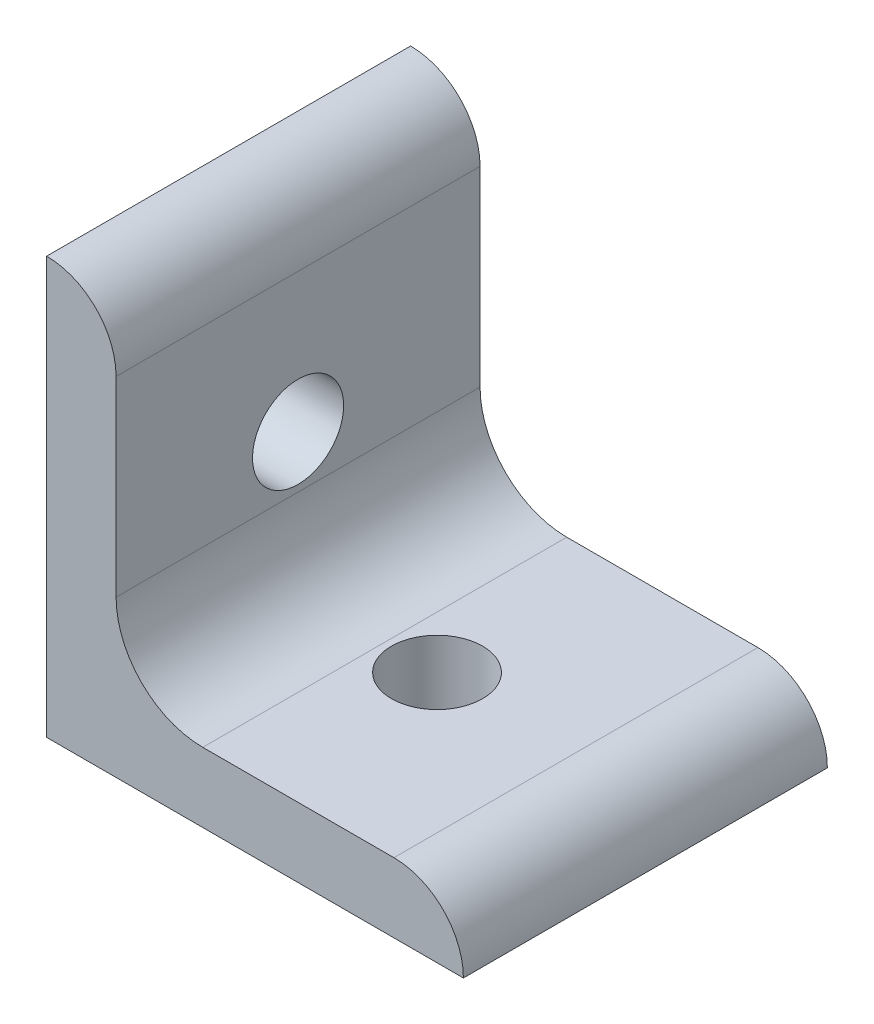
ISO-10303-21;
HEADER;
FILE_DESCRIPTION(('STEP AP214'),'2;1');
FILE_NAME('part.step','',(''),(''),'','','');
FILE_SCHEMA(('AUTOMOTIVE_DESIGN { 1 0 10303 214 1 1 1 1 }'));
ENDSEC;
DATA;
#1=APPLICATION_CONTEXT('core data for automotive mechanical design processes');
#2=APPLICATION_PROTOCOL_DEFINITION('international standard','automotive_design',2000,#1);
#3=PRODUCT_CONTEXT('',#1,'mechanical');
#4=PRODUCT('Part','Part','',(#3));
#5=PRODUCT_RELATED_PRODUCT_CATEGORY('part','',(#4));
#6=PRODUCT_DEFINITION_FORMATION('','',#4);
#7=PRODUCT_DEFINITION_CONTEXT('part definition',#1,'design');
#8=PRODUCT_DEFINITION('design','',#6,#7);
#9=PRODUCT_DEFINITION_SHAPE('','',#8);
#10=(LENGTH_UNIT() NAMED_UNIT(*) SI_UNIT(.MILLI.,.METRE.));
#11=(NAMED_UNIT(*) PLANE_ANGLE_UNIT() SI_UNIT($,.RADIAN.));
#12=(NAMED_UNIT(*) SI_UNIT($,.STERADIAN.) SOLID_ANGLE_UNIT());
#13=UNCERTAINTY_MEASURE_WITH_UNIT(LENGTH_MEASURE(1.E-05),#10,'distance_accuracy_value','');
#14=(GEOMETRIC_REPRESENTATION_CONTEXT(3) GLOBAL_UNCERTAINTY_ASSIGNED_CONTEXT((#13)) GLOBAL_UNIT_ASSIGNED_CONTEXT((#10,
#11,#12)) REPRESENTATION_CONTEXT('',''));
#15=CARTESIAN_POINT('',(0.,0.,0.));
#16=DIRECTION('',(0.,0.,1.));
#17=DIRECTION('',(1.,0.,0.));
#18=AXIS2_PLACEMENT_3D('',#15,#16,#17);
#19=CARTESIAN_POINT('',(6.35,31.75,16.637));
#20=DIRECTION('',(-1.,0.,0.));
#21=DIRECTION('',(0.,-1.,0.));
#22=AXIS2_PLACEMENT_3D('',#19,#20,#21);
#23=PLANE('',#22);
#24=DIRECTION('',(0.,1.,0.));
#25=VECTOR('',#24,1.);
#26=CARTESIAN_POINT('',(6.35,31.75,-16.637));
#27=LINE('',#26,#25);
#28=CARTESIAN_POINT('',(6.35,14.2748,-16.637));
#29=VERTEX_POINT('',#28);
#30=CARTESIAN_POINT('',(6.35,31.75,-16.637));
#31=VERTEX_POINT('',#30);
#32=EDGE_CURVE('E114',#29,#31,#27,.T.);
#33=ORIENTED_EDGE('',*,*,#32,.T.);
#34=DIRECTION('',(0.,0.,-1.));
#35=VECTOR('',#34,1.);
#36=CARTESIAN_POINT('',(6.35,31.75,16.637));
#37=LINE('',#36,#35);
#38=CARTESIAN_POINT('',(6.35,31.75,16.637));
#39=VERTEX_POINT('',#38);
#40=EDGE_CURVE('E111',#39,#31,#37,.T.);
#41=ORIENTED_EDGE('',*,*,#40,.F.);
#42=DIRECTION('',(0.,1.,0.));
#43=VECTOR('',#42,1.);
#44=CARTESIAN_POINT('',(6.35,31.75,16.637));
#45=LINE('',#44,#43);
#46=CARTESIAN_POINT('',(6.35,14.2748,16.637));
#47=VERTEX_POINT('',#46);
#48=EDGE_CURVE('E100',#47,#39,#45,.T.);
#49=ORIENTED_EDGE('',*,*,#48,.F.);
#50=DIRECTION('',(0.,0.,-1.));
#51=VECTOR('',#50,1.);
#52=CARTESIAN_POINT('',(6.35,14.2748,16.637));
#53=LINE('',#52,#51);
#54=EDGE_CURVE('E115',#47,#29,#53,.T.);
#55=ORIENTED_EDGE('',*,*,#54,.T.);
#56=EDGE_LOOP('',(#33,#41,#49,#55));
#57=FACE_BOUND('',#56,.T.);
#58=CARTESIAN_POINT('',(6.34999999999999,19.05,0.));
#59=DIRECTION('',(-1.,0.,0.));
#60=DIRECTION('',(0.,-1.,0.));
#61=AXIS2_PLACEMENT_3D('',#58,#59,#60);
#62=CIRCLE('',#61,4.1656);
#63=CARTESIAN_POINT('',(6.35,14.8844,0.));
#64=VERTEX_POINT('',#63);
#65=EDGE_CURVE('E164',#64,#64,#62,.F.);
#66=ORIENTED_EDGE('',*,*,#65,.F.);
#67=EDGE_LOOP('',(#66));
#68=FACE_BOUND('',#67,.T.);
#69=ADVANCED_FACE('F32',(#57,#68),#23,.F.);
#70=CARTESIAN_POINT('',(0.,0.,16.637));
#71=DIRECTION('',(1.,0.,0.));
#72=DIRECTION('',(0.,0.,-1.));
#73=AXIS2_PLACEMENT_3D('',#70,#71,#72);
#74=PLANE('',#73);
#75=DIRECTION('',(0.,-1.,0.));
#76=VECTOR('',#75,1.);
#77=CARTESIAN_POINT('',(0.,0.,-16.637));
#78=LINE('',#77,#76);
#79=CARTESIAN_POINT('',(0.,38.1,-16.637));
#80=VERTEX_POINT('',#79);
#81=CARTESIAN_POINT('',(0.,0.,-16.637));
#82=VERTEX_POINT('',#81);
#83=EDGE_CURVE('E82',#80,#82,#78,.T.);
#84=ORIENTED_EDGE('',*,*,#83,.T.);
#85=DIRECTION('',(0.,0.,-1.));
#86=VECTOR('',#85,1.);
#87=CARTESIAN_POINT('',(0.,0.,16.637));
#88=LINE('',#87,#86);
#89=CARTESIAN_POINT('',(0.,0.,16.637));
#90=VERTEX_POINT('',#89);
#91=EDGE_CURVE('E120',#90,#82,#88,.T.);
#92=ORIENTED_EDGE('',*,*,#91,.F.);
#93=DIRECTION('',(0.,-1.,0.));
#94=VECTOR('',#93,1.);
#95=CARTESIAN_POINT('',(0.,0.,16.637));
#96=LINE('',#95,#94);
#97=CARTESIAN_POINT('',(0.,38.1,16.637));
#98=VERTEX_POINT('',#97);
#99=EDGE_CURVE('E50',#98,#90,#96,.T.);
#100=ORIENTED_EDGE('',*,*,#99,.F.);
#101=DIRECTION('',(0.,0.,-1.));
#102=VECTOR('',#101,1.);
#103=CARTESIAN_POINT('',(0.,38.1,16.637));
#104=LINE('',#103,#102);
#105=EDGE_CURVE('E116',#98,#80,#104,.T.);
#106=ORIENTED_EDGE('',*,*,#105,.T.);
#107=EDGE_LOOP('',(#84,#92,#100,#106));
#108=FACE_BOUND('',#107,.T.);
#109=CARTESIAN_POINT('',(0.,19.05,0.));
#110=DIRECTION('',(1.,0.,0.));
#111=DIRECTION('',(0.,0.,-1.));
#112=AXIS2_PLACEMENT_3D('',#109,#110,#111);
#113=CIRCLE('',#112,4.1656);
#114=CARTESIAN_POINT('',(0.,19.05,-4.1656));
#115=VERTEX_POINT('',#114);
#116=EDGE_CURVE('E167',#115,#115,#113,.T.);
#117=ORIENTED_EDGE('',*,*,#116,.T.);
#118=EDGE_LOOP('',(#117));
#119=FACE_BOUND('',#118,.T.);
#120=ADVANCED_FACE('F171',(#108,#119),#74,.F.);
#121=CARTESIAN_POINT('',(38.1,0.,16.637));
#122=DIRECTION('',(0.,1.,0.));
#123=DIRECTION('',(-1.,0.,0.));
#124=AXIS2_PLACEMENT_3D('',#121,#122,#123);
#125=PLANE('',#124);
#126=DIRECTION('',(1.,0.,0.));
#127=VECTOR('',#126,1.);
#128=CARTESIAN_POINT('',(38.1,0.,-16.637));
#129=LINE('',#128,#127);
#130=CARTESIAN_POINT('',(38.1,0.,-16.637));
#131=VERTEX_POINT('',#130);
#132=EDGE_CURVE('E124',#82,#131,#129,.T.);
#133=ORIENTED_EDGE('',*,*,#132,.T.);
#134=DIRECTION('',(0.,0.,-1.));
#135=VECTOR('',#134,1.);
#136=CARTESIAN_POINT('',(38.1,0.,16.637));
#137=LINE('',#136,#135);
#138=CARTESIAN_POINT('',(38.1,0.,16.637));
#139=VERTEX_POINT('',#138);
#140=EDGE_CURVE('E11',#139,#131,#137,.T.);
#141=ORIENTED_EDGE('',*,*,#140,.F.);
#142=DIRECTION('',(1.,0.,0.));
#143=VECTOR('',#142,1.);
#144=CARTESIAN_POINT('',(38.1,0.,16.637));
#145=LINE('',#144,#143);
#146=EDGE_CURVE('E136',#90,#139,#145,.T.);
#147=ORIENTED_EDGE('',*,*,#146,.F.);
#148=ORIENTED_EDGE('',*,*,#91,.T.);
#149=EDGE_LOOP('',(#133,#141,#147,#148));
#150=FACE_BOUND('',#149,.T.);
#151=CARTESIAN_POINT('',(19.05,0.,0.));
#152=DIRECTION('',(0.,1.,0.));
#153=DIRECTION('',(0.,0.,1.));
#154=AXIS2_PLACEMENT_3D('',#151,#152,#153);
#155=CIRCLE('',#154,4.1656);
#156=CARTESIAN_POINT('',(19.05,0.,-4.1656));
#157=VERTEX_POINT('',#156);
#158=EDGE_CURVE('E161',#157,#157,#155,.T.);
#159=ORIENTED_EDGE('',*,*,#158,.T.);
#160=EDGE_LOOP('',(#159));
#161=FACE_BOUND('',#160,.T.);
#162=ADVANCED_FACE('F34',(#150,#161),#125,.F.);
#163=CARTESIAN_POINT('',(14.2748,6.35,16.637));
#164=DIRECTION('',(0.,-1.,0.));
#165=DIRECTION('',(0.,0.,-1.));
#166=AXIS2_PLACEMENT_3D('',#163,#164,#165);
#167=PLANE('',#166);
#168=DIRECTION('',(-1.,0.,0.));
#169=VECTOR('',#168,1.);
#170=CARTESIAN_POINT('',(14.2748,6.35,-16.637));
#171=LINE('',#170,#169);
#172=CARTESIAN_POINT('',(31.75,6.35,-16.637));
#173=VERTEX_POINT('',#172);
#174=CARTESIAN_POINT('',(14.2748,6.35,-16.637));
#175=VERTEX_POINT('',#174);
#176=EDGE_CURVE('E129',#173,#175,#171,.T.);
#177=ORIENTED_EDGE('',*,*,#176,.T.);
#178=DIRECTION('',(0.,0.,-1.));
#179=VECTOR('',#178,1.);
#180=CARTESIAN_POINT('',(14.2748,6.35,16.637));
#181=LINE('',#180,#179);
#182=CARTESIAN_POINT('',(14.2748,6.35,16.637));
#183=VERTEX_POINT('',#182);
#184=EDGE_CURVE('E140',#183,#175,#181,.T.);
#185=ORIENTED_EDGE('',*,*,#184,.F.);
#186=DIRECTION('',(-1.,0.,0.));
#187=VECTOR('',#186,1.);
#188=CARTESIAN_POINT('',(14.2748,6.35,16.637));
#189=LINE('',#188,#187);
#190=CARTESIAN_POINT('',(31.75,6.35,16.637));
#191=VERTEX_POINT('',#190);
#192=EDGE_CURVE('E150',#191,#183,#189,.T.);
#193=ORIENTED_EDGE('',*,*,#192,.F.);
#194=DIRECTION('',(0.,0.,-1.));
#195=VECTOR('',#194,1.);
#196=CARTESIAN_POINT('',(31.75,6.35,16.637));
#197=LINE('',#196,#195);
#198=EDGE_CURVE('E42',#191,#173,#197,.T.);
#199=ORIENTED_EDGE('',*,*,#198,.T.);
#200=EDGE_LOOP('',(#177,#185,#193,#199));
#201=FACE_BOUND('',#200,.T.);
#202=CARTESIAN_POINT('',(19.05,6.35,0.));
#203=DIRECTION('',(0.,-1.,0.));
#204=DIRECTION('',(0.,0.,-1.));
#205=AXIS2_PLACEMENT_3D('',#202,#203,#204);
#206=CIRCLE('',#205,4.1656);
#207=CARTESIAN_POINT('',(19.05,6.35000000000001,-4.1656));
#208=VERTEX_POINT('',#207);
#209=EDGE_CURVE('E36',#208,#208,#206,.F.);
#210=ORIENTED_EDGE('',*,*,#209,.F.);
#211=EDGE_LOOP('',(#210));
#212=FACE_BOUND('',#211,.T.);
#213=ADVANCED_FACE('F147',(#201,#212),#167,.F.);
#214=CARTESIAN_POINT('',(31.75,0.,16.637));
#215=DIRECTION('',(0.,0.,-1.));
#216=DIRECTION('',(-1.,0.,0.));
#217=AXIS2_PLACEMENT_3D('',#214,#215,#216);
#218=CYLINDRICAL_SURFACE('',#217,6.35);
#219=CARTESIAN_POINT('',(31.75,0.,-16.637));
#220=DIRECTION('',(0.,0.,1.));
#221=DIRECTION('',(1.,0.,0.));
#222=AXIS2_PLACEMENT_3D('',#219,#220,#221);
#223=CIRCLE('',#222,6.35);
#224=EDGE_CURVE('E127',#131,#173,#223,.T.);
#225=ORIENTED_EDGE('',*,*,#224,.T.);
#226=ORIENTED_EDGE('',*,*,#198,.F.);
#227=CARTESIAN_POINT('',(31.75,0.,16.637));
#228=DIRECTION('',(0.,0.,1.));
#229=DIRECTION('',(1.,0.,0.));
#230=AXIS2_PLACEMENT_3D('',#227,#228,#229);
#231=CIRCLE('',#230,6.35);
#232=EDGE_CURVE('E90',#139,#191,#231,.T.);
#233=ORIENTED_EDGE('',*,*,#232,.F.);
#234=ORIENTED_EDGE('',*,*,#140,.T.);
#235=EDGE_LOOP('',(#225,#226,#233,#234));
#236=FACE_BOUND('',#235,.T.);
#237=ADVANCED_FACE('F189',(#236),#218,.T.);
#238=CARTESIAN_POINT('',(14.2748,14.2748,16.637));
#239=DIRECTION('',(0.,0.,-1.));
#240=DIRECTION('',(-1.,0.,0.));
#241=AXIS2_PLACEMENT_3D('',#238,#239,#240);
#242=CYLINDRICAL_SURFACE('',#241,7.9248);
#243=CARTESIAN_POINT('',(14.2748,14.2748,-16.637));
#244=DIRECTION('',(0.,0.,-1.));
#245=DIRECTION('',(1.,0.,0.));
#246=AXIS2_PLACEMENT_3D('',#243,#244,#245);
#247=CIRCLE('',#246,7.9248);
#248=EDGE_CURVE('E131',#175,#29,#247,.T.);
#249=ORIENTED_EDGE('',*,*,#248,.T.);
#250=ORIENTED_EDGE('',*,*,#54,.F.);
#251=CARTESIAN_POINT('',(14.2748,14.2748,16.637));
#252=DIRECTION('',(0.,0.,-1.));
#253=DIRECTION('',(1.,0.,0.));
#254=AXIS2_PLACEMENT_3D('',#251,#252,#253);
#255=CIRCLE('',#254,7.9248);
#256=EDGE_CURVE('E106',#183,#47,#255,.T.);
#257=ORIENTED_EDGE('',*,*,#256,.F.);
#258=ORIENTED_EDGE('',*,*,#184,.T.);
#259=EDGE_LOOP('',(#249,#250,#257,#258));
#260=FACE_BOUND('',#259,.T.);
#261=ADVANCED_FACE('F156',(#260),#242,.F.);
#262=CARTESIAN_POINT('',(0.,31.75,16.637));
#263=DIRECTION('',(0.,0.,-1.));
#264=DIRECTION('',(-1.,0.,0.));
#265=AXIS2_PLACEMENT_3D('',#262,#263,#264);
#266=CYLINDRICAL_SURFACE('',#265,6.35);
#267=CARTESIAN_POINT('',(0.,31.75,-16.637));
#268=DIRECTION('',(0.,0.,1.));
#269=DIRECTION('',(1.,0.,0.));
#270=AXIS2_PLACEMENT_3D('',#267,#268,#269);
#271=CIRCLE('',#270,6.35);
#272=EDGE_CURVE('E76',#31,#80,#271,.T.);
#273=ORIENTED_EDGE('',*,*,#272,.T.);
#274=ORIENTED_EDGE('',*,*,#105,.F.);
#275=CARTESIAN_POINT('',(0.,31.75,16.637));
#276=DIRECTION('',(0.,0.,1.));
#277=DIRECTION('',(1.,0.,0.));
#278=AXIS2_PLACEMENT_3D('',#275,#276,#277);
#279=CIRCLE('',#278,6.35);
#280=EDGE_CURVE('E104',#39,#98,#279,.T.);
#281=ORIENTED_EDGE('',*,*,#280,.F.);
#282=ORIENTED_EDGE('',*,*,#40,.T.);
#283=EDGE_LOOP('',(#273,#274,#281,#282));
#284=FACE_BOUND('',#283,.T.);
#285=ADVANCED_FACE('F118',(#284),#266,.T.);
#286=CARTESIAN_POINT('',(0.,31.75,16.637));
#287=DIRECTION('',(0.,0.,1.));
#288=DIRECTION('',(1.,0.,0.));
#289=AXIS2_PLACEMENT_3D('',#286,#287,#288);
#290=PLANE('',#289);
#291=ORIENTED_EDGE('',*,*,#146,.T.);
#292=ORIENTED_EDGE('',*,*,#232,.T.);
#293=ORIENTED_EDGE('',*,*,#192,.T.);
#294=ORIENTED_EDGE('',*,*,#256,.T.);
#295=ORIENTED_EDGE('',*,*,#48,.T.);
#296=ORIENTED_EDGE('',*,*,#280,.T.);
#297=ORIENTED_EDGE('',*,*,#99,.T.);
#298=EDGE_LOOP('',(#291,#292,#293,#294,#295,#296,#297));
#299=FACE_BOUND('',#298,.T.);
#300=ADVANCED_FACE('F102',(#299),#290,.T.);
#301=CARTESIAN_POINT('',(0.,31.75,-16.637));
#302=DIRECTION('',(0.,0.,1.));
#303=DIRECTION('',(1.,0.,0.));
#304=AXIS2_PLACEMENT_3D('',#301,#302,#303);
#305=PLANE('',#304);
#306=ORIENTED_EDGE('',*,*,#132,.F.);
#307=ORIENTED_EDGE('',*,*,#83,.F.);
#308=ORIENTED_EDGE('',*,*,#272,.F.);
#309=ORIENTED_EDGE('',*,*,#32,.F.);
#310=ORIENTED_EDGE('',*,*,#248,.F.);
#311=ORIENTED_EDGE('',*,*,#176,.F.);
#312=ORIENTED_EDGE('',*,*,#224,.F.);
#313=EDGE_LOOP('',(#306,#307,#308,#309,#310,#311,#312));
#314=FACE_BOUND('',#313,.T.);
#315=ADVANCED_FACE('F154',(#314),#305,.F.);
#316=CARTESIAN_POINT('',(19.05,38.1,0.));
#317=DIRECTION('',(0.,-1.,0.));
#318=DIRECTION('',(0.,0.,-1.));
#319=AXIS2_PLACEMENT_3D('',#316,#317,#318);
#320=CYLINDRICAL_SURFACE('',#319,4.1656);
#321=CARTESIAN_POINT('',(19.05,0.,-4.1656));
#322=CARTESIAN_POINT('',(19.05,0.0661458333333341,-4.1656));
#323=CARTESIAN_POINT('',(19.05,0.132291666666668,-4.1656));
#324=CARTESIAN_POINT('',(19.05,0.264583333333334,-4.1656));
#325=CARTESIAN_POINT('',(19.05,0.330729166666666,-4.1656));
#326=CARTESIAN_POINT('',(19.05,0.463020833333332,-4.1656));
#327=CARTESIAN_POINT('',(19.05,0.529166666666666,-4.1656));
#328=CARTESIAN_POINT('',(19.05,0.661458333333334,-4.1656));
#329=CARTESIAN_POINT('',(19.05,0.727604166666669,-4.1656));
#330=CARTESIAN_POINT('',(19.05,0.859895833333335,-4.1656));
#331=CARTESIAN_POINT('',(19.05,0.926041666666666,-4.1656));
#332=CARTESIAN_POINT('',(19.05,1.05833333333333,-4.1656));
#333=CARTESIAN_POINT('',(19.05,1.12447916666667,-4.1656));
#334=CARTESIAN_POINT('',(19.05,1.25677083333333,-4.1656));
#335=CARTESIAN_POINT('',(19.05,1.32291666666667,-4.1656));
#336=CARTESIAN_POINT('',(19.05,1.45520833333334,-4.1656));
#337=CARTESIAN_POINT('',(19.05,1.52135416666667,-4.1656));
#338=CARTESIAN_POINT('',(19.05,1.65364583333334,-4.1656));
#339=CARTESIAN_POINT('',(19.05,1.71979166666667,-4.1656));
#340=CARTESIAN_POINT('',(19.05,1.85208333333334,-4.1656));
#341=CARTESIAN_POINT('',(19.05,1.91822916666667,-4.1656));
#342=CARTESIAN_POINT('',(19.05,2.05052083333334,-4.1656));
#343=CARTESIAN_POINT('',(19.05,2.11666666666667,-4.1656));
#344=CARTESIAN_POINT('',(19.05,2.24895833333334,-4.1656));
#345=CARTESIAN_POINT('',(19.05,2.31510416666667,-4.1656));
#346=CARTESIAN_POINT('',(19.05,2.44739583333334,-4.1656));
#347=CARTESIAN_POINT('',(19.05,2.51354166666667,-4.1656));
#348=CARTESIAN_POINT('',(19.05,2.64583333333334,-4.1656));
#349=CARTESIAN_POINT('',(19.05,2.71197916666667,-4.1656));
#350=CARTESIAN_POINT('',(19.05,2.84427083333334,-4.1656));
#351=CARTESIAN_POINT('',(19.05,2.91041666666667,-4.1656));
#352=CARTESIAN_POINT('',(19.05,3.04270833333334,-4.1656));
#353=CARTESIAN_POINT('',(19.05,3.10885416666667,-4.1656));
#354=CARTESIAN_POINT('',(19.05,3.24114583333334,-4.1656));
#355=CARTESIAN_POINT('',(19.05,3.30729166666667,-4.1656));
#356=CARTESIAN_POINT('',(19.05,3.43958333333334,-4.1656));
#357=CARTESIAN_POINT('',(19.05,3.50572916666667,-4.1656));
#358=CARTESIAN_POINT('',(19.05,3.63802083333334,-4.1656));
#359=CARTESIAN_POINT('',(19.05,3.70416666666667,-4.1656));
#360=CARTESIAN_POINT('',(19.05,3.83645833333334,-4.1656));
#361=CARTESIAN_POINT('',(19.05,3.90260416666667,-4.1656));
#362=CARTESIAN_POINT('',(19.05,4.03489583333334,-4.1656));
#363=CARTESIAN_POINT('',(19.05,4.10104166666667,-4.1656));
#364=CARTESIAN_POINT('',(19.05,4.23333333333334,-4.1656));
#365=CARTESIAN_POINT('',(19.05,4.29947916666667,-4.1656));
#366=CARTESIAN_POINT('',(19.05,4.43177083333334,-4.1656));
#367=CARTESIAN_POINT('',(19.05,4.49791666666667,-4.1656));
#368=CARTESIAN_POINT('',(19.05,4.63020833333334,-4.1656));
#369=CARTESIAN_POINT('',(19.05,4.69635416666667,-4.1656));
#370=CARTESIAN_POINT('',(19.05,4.82864583333334,-4.1656));
#371=CARTESIAN_POINT('',(19.05,4.89479166666667,-4.1656));
#372=CARTESIAN_POINT('',(19.05,5.02708333333334,-4.1656));
#373=CARTESIAN_POINT('',(19.05,5.09322916666667,-4.1656));
#374=CARTESIAN_POINT('',(19.05,5.22552083333334,-4.1656));
#375=CARTESIAN_POINT('',(19.05,5.29166666666667,-4.1656));
#376=CARTESIAN_POINT('',(19.05,5.42395833333334,-4.1656));
#377=CARTESIAN_POINT('',(19.05,5.49010416666667,-4.1656));
#378=CARTESIAN_POINT('',(19.05,5.62239583333334,-4.1656));
#379=CARTESIAN_POINT('',(19.05,5.68854166666667,-4.1656));
#380=CARTESIAN_POINT('',(19.05,5.82083333333334,-4.1656));
#381=CARTESIAN_POINT('',(19.05,5.88697916666668,-4.1656));
#382=CARTESIAN_POINT('',(19.05,6.01927083333334,-4.1656));
#383=CARTESIAN_POINT('',(19.05,6.08541666666667,-4.1656));
#384=CARTESIAN_POINT('',(19.05,6.21770833333334,-4.1656));
#385=CARTESIAN_POINT('',(19.05,6.28385416666667,-4.1656));
#386=CARTESIAN_POINT('',(19.05,6.35000000000001,-4.1656));
#387=B_SPLINE_CURVE_WITH_KNOTS('',3,(#321,#322,#323,#324,#325,#326,#327,#328,#329,#330,#331,
#332,#333,#334,#335,#336,#337,#338,#339,#340,#341,#342,#343,#344,#345,#346,#347,#348,#349,#350,
#351,#352,#353,#354,#355,#356,#357,#358,#359,#360,#361,#362,#363,#364,#365,#366,#367,#368,#369,
#370,#371,#372,#373,#374,#375,#376,#377,#378,#379,#380,#381,#382,#383,#384,#385,#386),
.UNSPECIFIED.,.F.,.F.,(4,2,2,2,2,2,2,2,2,2,2,2,2,2,2,2,2,2,2,2,2,2,2,2,2,2,2,2,2,2,2,2,4),(0.,
0.198437500000002,0.396874999999998,0.5953125,0.793750000000003,0.992187499999998,1.190625,
1.3890625,1.58750000000001,1.7859375,1.984375,2.18281250000001,2.38125,2.5796875,
2.77812500000001,2.9765625,3.175,3.37343750000001,3.571875,3.7703125,3.96875000000001,4.1671875,
4.365625,4.56406250000001,4.7625,4.96093750000001,5.15937500000001,5.3578125,5.55625000000001,
5.75468750000001,5.95312500000001,6.15156250000001,6.35000000000001),.UNSPECIFIED.);
#388=EDGE_CURVE('BSEAM176',#157,#208,#387,.T.);
#389=ORIENTED_EDGE('',*,*,#158,.F.);
#390=ORIENTED_EDGE('',*,*,#209,.T.);
#391=ORIENTED_EDGE('',*,*,#388,.T.);
#392=ORIENTED_EDGE('',*,*,#388,.F.);
#393=EDGE_LOOP('',(#389,#391,#390,#392));
#394=FACE_BOUND('',#393,.T.);
#395=ADVANCED_FACE('F176',(#394),#320,.F.);
#396=CARTESIAN_POINT('',(38.1,19.05,0.));
#397=DIRECTION('',(-1.,0.,0.));
#398=DIRECTION('',(0.,0.,1.));
#399=AXIS2_PLACEMENT_3D('',#396,#397,#398);
#400=CYLINDRICAL_SURFACE('',#399,4.1656);
#401=ORIENTED_EDGE('',*,*,#116,.F.);
#402=EDGE_LOOP('',(#401));
#403=FACE_BOUND('',#402,.T.);
#404=ORIENTED_EDGE('',*,*,#65,.T.);
#405=EDGE_LOOP('',(#404));
#406=FACE_BOUND('',#405,.T.);
#407=ADVANCED_FACE('F173',(#403,#406),#400,.F.);
#408=CLOSED_SHELL('',(#69,#120,#162,#213,#237,#261,#285,#300,#315,#395,#407));
#409=MANIFOLD_SOLID_BREP('B2',#408);
#410=ADVANCED_BREP_SHAPE_REPRESENTATION('',(#18,#409),#14);
#411=SHAPE_DEFINITION_REPRESENTATION(#9,#410);
ENDSEC;
END-ISO-10303-21;
